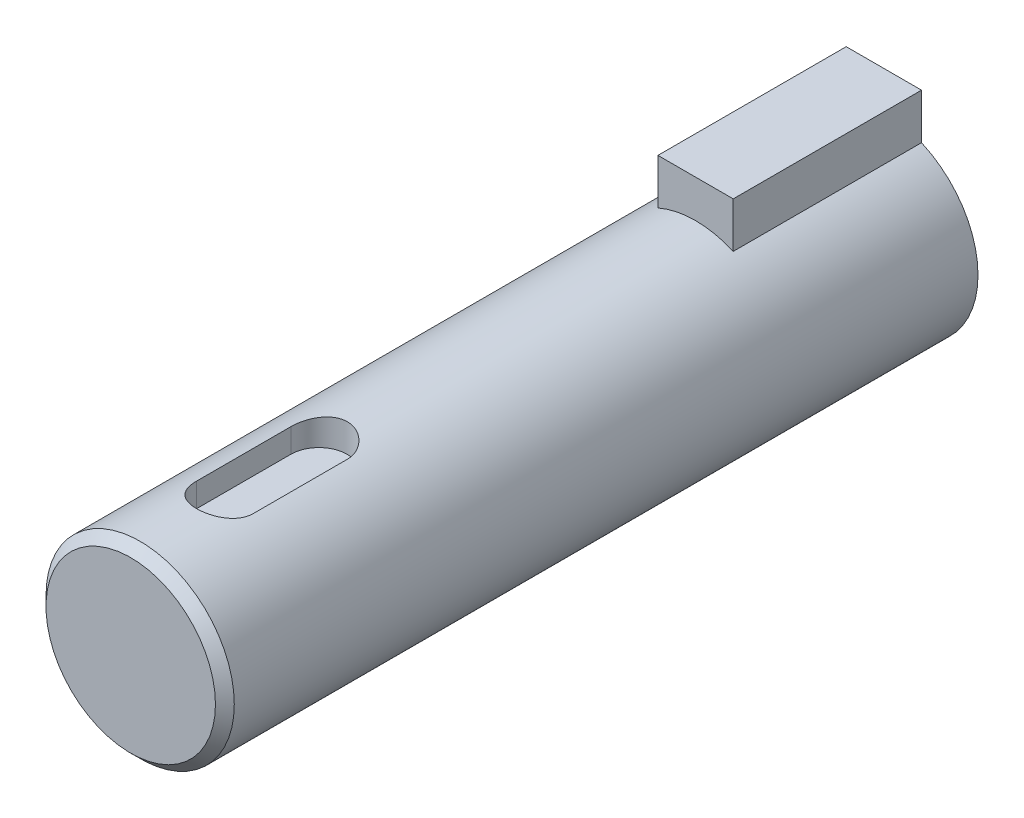
ISO-10303-21;
HEADER;
FILE_DESCRIPTION(('STEP AP214'),'2;1');
FILE_NAME('part.step','',(''),(''),'','','');
FILE_SCHEMA(('AUTOMOTIVE_DESIGN { 1 0 10303 214 1 1 1 1 }'));
ENDSEC;
DATA;
#1=APPLICATION_CONTEXT('core data for automotive mechanical design processes');
#2=APPLICATION_PROTOCOL_DEFINITION('international standard','automotive_design',2000,#1);
#3=PRODUCT_CONTEXT('',#1,'mechanical');
#4=PRODUCT('Part','Part','',(#3));
#5=PRODUCT_RELATED_PRODUCT_CATEGORY('part','',(#4));
#6=PRODUCT_DEFINITION_FORMATION('','',#4);
#7=PRODUCT_DEFINITION_CONTEXT('part definition',#1,'design');
#8=PRODUCT_DEFINITION('design','',#6,#7);
#9=PRODUCT_DEFINITION_SHAPE('','',#8);
#10=(LENGTH_UNIT() NAMED_UNIT(*) SI_UNIT(.MILLI.,.METRE.));
#11=(NAMED_UNIT(*) PLANE_ANGLE_UNIT() SI_UNIT($,.RADIAN.));
#12=(NAMED_UNIT(*) SI_UNIT($,.STERADIAN.) SOLID_ANGLE_UNIT());
#13=UNCERTAINTY_MEASURE_WITH_UNIT(LENGTH_MEASURE(1.E-05),#10,'distance_accuracy_value','');
#14=(GEOMETRIC_REPRESENTATION_CONTEXT(3) GLOBAL_UNCERTAINTY_ASSIGNED_CONTEXT((#13)) GLOBAL_UNIT_ASSIGNED_CONTEXT((#10,
#11,#12)) REPRESENTATION_CONTEXT('',''));
#15=CARTESIAN_POINT('',(0.,0.,0.));
#16=DIRECTION('',(0.,0.,1.));
#17=DIRECTION('',(1.,0.,0.));
#18=AXIS2_PLACEMENT_3D('',#15,#16,#17);
#19=CARTESIAN_POINT('',(0.,0.,10.));
#20=DIRECTION('',(0.,0.,-1.));
#21=DIRECTION('',(-1.,0.,0.));
#22=AXIS2_PLACEMENT_3D('',#19,#20,#21);
#23=CYLINDRICAL_SURFACE('',#22,5.);
#24=CARTESIAN_POINT('',(0.,0.,39.5));
#25=DIRECTION('',(0.,0.,1.));
#26=DIRECTION('',(1.,0.,0.));
#27=AXIS2_PLACEMENT_3D('',#24,#25,#26);
#28=CIRCLE('',#27,5.);
#29=CARTESIAN_POINT('',(5.,0.,39.5));
#30=VERTEX_POINT('',#29);
#31=EDGE_CURVE('E11',#30,#30,#28,.F.);
#32=ORIENTED_EDGE('',*,*,#31,.T.);
#33=EDGE_LOOP('',(#32));
#34=FACE_BOUND('',#33,.T.);
#35=CARTESIAN_POINT('',(0.,0.,0.));
#36=DIRECTION('',(0.,0.,1.));
#37=DIRECTION('',(1.,0.,0.));
#38=AXIS2_PLACEMENT_3D('',#35,#36,#37);
#39=CIRCLE('',#38,5.);
#40=CARTESIAN_POINT('',(-2.,4.58257569495585,0.));
#41=VERTEX_POINT('',#40);
#42=CARTESIAN_POINT('',(2.00000000000001,4.58257569495584,0.));
#43=VERTEX_POINT('',#42);
#44=EDGE_CURVE('E82',#41,#43,#39,.T.);
#45=ORIENTED_EDGE('',*,*,#44,.T.);
#46=DIRECTION('',(0.,0.,-1.));
#47=VECTOR('',#46,1.);
#48=CARTESIAN_POINT('',(2.,4.58257569495584,10.));
#49=LINE('',#48,#47);
#50=CARTESIAN_POINT('',(2.,4.58257569495584,10.));
#51=VERTEX_POINT('',#50);
#52=EDGE_CURVE('E154',#51,#43,#49,.T.);
#53=ORIENTED_EDGE('',*,*,#52,.F.);
#54=CARTESIAN_POINT('',(0.,0.,10.));
#55=DIRECTION('',(0.,0.,1.));
#56=DIRECTION('',(1.,0.,0.));
#57=AXIS2_PLACEMENT_3D('',#54,#55,#56);
#58=CIRCLE('',#57,5.);
#59=CARTESIAN_POINT('',(-2.,4.58257569495585,10.));
#60=VERTEX_POINT('',#59);
#61=EDGE_CURVE('E124',#51,#60,#58,.T.);
#62=ORIENTED_EDGE('',*,*,#61,.T.);
#63=DIRECTION('',(0.,0.,-1.));
#64=VECTOR('',#63,1.);
#65=CARTESIAN_POINT('',(-2.,4.58257569495585,10.));
#66=LINE('',#65,#64);
#67=EDGE_CURVE('E163',#60,#41,#66,.T.);
#68=ORIENTED_EDGE('',*,*,#67,.T.);
#69=EDGE_LOOP('',(#45,#53,#62,#68));
#70=FACE_BOUND('',#69,.T.);
#71=CARTESIAN_POINT('',(1.5,4.76969600708473,30.));
#72=CARTESIAN_POINT('',(1.5000008535707,4.76969249084934,29.958820607092));
#73=CARTESIAN_POINT('',(1.49830317083427,4.77022997000129,29.9176619568739));
#74=CARTESIAN_POINT('',(1.49153785660316,4.77235095109998,29.8356588379045));
#75=CARTESIAN_POINT('',(1.4864709827584,4.77393421787376,29.7948143006051));
#76=CARTESIAN_POINT('',(1.4663020368931,4.78018490618873,29.6734094590454));
#77=CARTESIAN_POINT('',(1.44623120413662,4.78635370384275,29.5936936095836));
#78=CARTESIAN_POINT('',(1.39353102315626,4.80195952113209,29.4389644216141));
#79=CARTESIAN_POINT('',(1.36090607068203,4.81139539670393,29.3639494478019));
#80=CARTESIAN_POINT('',(1.28407841117655,4.83246571212052,29.2204033184024));
#81=CARTESIAN_POINT('',(1.23987031651226,4.84410117434933,29.1518752002716));
#82=CARTESIAN_POINT('',(1.13964850658326,4.86866835244721,29.021133944003));
#83=CARTESIAN_POINT('',(1.08333433465208,4.88162755412974,28.9591563396566));
#84=CARTESIAN_POINT('',(0.96113891987335,4.9071481155905,28.8453644161001));
#85=CARTESIAN_POINT('',(0.895256063916347,4.91970940785251,28.793551813997));
#86=CARTESIAN_POINT('',(0.754109921315429,4.94333239727707,28.7005362296815));
#87=CARTESIAN_POINT('',(0.678680819336255,4.95435770971354,28.6595748197021));
#88=CARTESIAN_POINT('',(0.521621185505771,4.97334469846208,28.5910115883819));
#89=CARTESIAN_POINT('',(0.439992259012927,4.98130716463904,28.5634063222057));
#90=CARTESIAN_POINT('',(0.27532469787488,4.99307639935003,28.523120200898));
#91=CARTESIAN_POINT('',(0.192393125294255,4.99699549276993,28.5100351420303));
#92=CARTESIAN_POINT('',(0.0254235719980827,5.00063202022425,28.4978826586368));
#93=CARTESIAN_POINT('',(-0.0586141962423612,5.00035024971471,28.4988125802999));
#94=CARTESIAN_POINT('',(-0.222571599946015,4.99569602566267,28.514392908759));
#95=CARTESIAN_POINT('',(-0.30253714546464,4.99145415509187,28.5286053449787));
#96=CARTESIAN_POINT('',(-0.458890052102028,4.9795151369998,28.5696316352381));
#97=CARTESIAN_POINT('',(-0.535277225532003,4.9718178084603,28.596446149456));
#98=CARTESIAN_POINT('',(-0.683347815892222,4.95365214926146,28.6622122216465));
#99=CARTESIAN_POINT('',(-0.754966006044144,4.94315255692526,28.701301644357));
#100=CARTESIAN_POINT('',(-0.890765529574421,4.92049624651755,28.7903985900483));
#101=CARTESIAN_POINT('',(-0.954945191614599,4.90833915735885,28.8404085594788));
#102=CARTESIAN_POINT('',(-1.07665450541275,4.8831167357141,28.9521919880835));
#103=CARTESIAN_POINT('',(-1.13383351478034,4.87003445449554,29.0143438637608));
#104=CARTESIAN_POINT('',(-1.23706769492487,4.84484215114658,29.1474974234279));
#105=CARTESIAN_POINT('',(-1.28311962013077,4.83273241337566,29.2185016803655));
#106=CARTESIAN_POINT('',(-1.36316407240863,4.81077228795653,29.3682809284493));
#107=CARTESIAN_POINT('',(-1.39703006341135,4.80094596245948,29.4471271795934));
#108=CARTESIAN_POINT('',(-1.45085886004699,4.78495663653201,29.6097245039818));
#109=CARTESIAN_POINT('',(-1.47084293218035,4.77878803475877,29.6934678607144));
#110=CARTESIAN_POINT('',(-1.48901203590079,4.77314032325007,29.8149948890702));
#111=CARTESIAN_POINT('',(-1.49313202989009,4.77185156275267,29.8518907341796));
#112=CARTESIAN_POINT('',(-1.49862355614855,4.77012928611782,29.9258514790995));
#113=CARTESIAN_POINT('',(-1.49999912968269,4.76969451246643,29.9629160496639));
#114=CARTESIAN_POINT('',(-1.5,4.76969600708473,30.));
#115=B_SPLINE_CURVE_WITH_KNOTS('',3,(#71,#72,#73,#74,#75,#76,#77,#78,#79,#80,#81,#82,#83,#84,
#85,#86,#87,#88,#89,#90,#91,#92,#93,#94,#95,#96,#97,#98,#99,#100,#101,#102,#103,#104,#105,#106,
#107,#108,#109,#110,#111,#112,#113,#114),.UNSPECIFIED.,.F.,.F.,(4,2,2,2,2,2,2,2,2,2,2,2,2,2,2,2,
2,2,2,2,2,4),(0.,0.123459071219734,0.246890388853044,0.492911349615218,0.738846245884327,
0.984895736828089,1.23795510798803,1.49105719006936,1.74939356197455,2.00766326783256,
2.25854751319801,2.5093842528947,2.75223130012966,2.99509107067835,3.2407824256273,
3.48652887757004,3.74172568310981,3.99699683536778,4.25484698071527,4.51230123440206,
4.62365084745809,4.73483637253615),.UNSPECIFIED.);
#116=CARTESIAN_POINT('',(1.5,4.76969600708473,30.));
#117=VERTEX_POINT('',#116);
#118=CARTESIAN_POINT('',(-1.5,4.76969600708473,30.));
#119=VERTEX_POINT('',#118);
#120=EDGE_CURVE('E121',#117,#119,#115,.T.);
#121=ORIENTED_EDGE('',*,*,#120,.F.);
#122=DIRECTION('',(0.,0.,-1.));
#123=VECTOR('',#122,1.);
#124=CARTESIAN_POINT('',(1.49999999999999,4.76969600708474,10.));
#125=LINE('',#124,#123);
#126=CARTESIAN_POINT('',(1.49999999999999,4.76969600708474,35.));
#127=VERTEX_POINT('',#126);
#128=EDGE_CURVE('E170',#127,#117,#125,.T.);
#129=ORIENTED_EDGE('',*,*,#128,.F.);
#130=CARTESIAN_POINT('',(-1.5,4.76969600708473,35.));
#131=CARTESIAN_POINT('',(-1.5000008535707,4.76969249084934,35.041179392908));
#132=CARTESIAN_POINT('',(-1.49830317083427,4.77022997000129,35.0823380431262));
#133=CARTESIAN_POINT('',(-1.49153785660316,4.77235095109999,35.1643411620956));
#134=CARTESIAN_POINT('',(-1.48647098275841,4.77393421787376,35.2051856993949));
#135=CARTESIAN_POINT('',(-1.46630203689311,4.78018490618874,35.3265905409547));
#136=CARTESIAN_POINT('',(-1.44623120413662,4.78635370384276,35.4063063904164));
#137=CARTESIAN_POINT('',(-1.39353102315626,4.8019595211321,35.5610355783859));
#138=CARTESIAN_POINT('',(-1.36090607068203,4.81139539670393,35.6360505521981));
#139=CARTESIAN_POINT('',(-1.28407841117656,4.83246571212052,35.7795966815976));
#140=CARTESIAN_POINT('',(-1.23987031651226,4.84410117434935,35.8481247997285));
#141=CARTESIAN_POINT('',(-1.13964850658326,4.86866835244722,35.9788660559971));
#142=CARTESIAN_POINT('',(-1.08333433465208,4.88162755412974,36.0408436603434));
#143=CARTESIAN_POINT('',(-0.961138919873351,4.9071481155905,36.1546355839));
#144=CARTESIAN_POINT('',(-0.895256063916347,4.91970940785251,36.2064481860031));
#145=CARTESIAN_POINT('',(-0.754109921315428,4.94333239727707,36.2994637703185));
#146=CARTESIAN_POINT('',(-0.678680819336255,4.95435770971354,36.340425180298));
#147=CARTESIAN_POINT('',(-0.521621185505768,4.97334469846208,36.4089884116182));
#148=CARTESIAN_POINT('',(-0.439992259012922,4.98130716463904,36.4365936777943));
#149=CARTESIAN_POINT('',(-0.275324697874874,4.99307639935003,36.4768797991021));
#150=CARTESIAN_POINT('',(-0.19239312529425,4.99699549276993,36.4899648579698));
#151=CARTESIAN_POINT('',(-0.0254235719980796,5.00063202022426,36.5021173413633));
#152=CARTESIAN_POINT('',(0.0586141962423633,5.00035024971471,36.5011874197002));
#153=CARTESIAN_POINT('',(0.222571599946017,4.99569602566267,36.485607091241));
#154=CARTESIAN_POINT('',(0.302537145464641,4.99145415509187,36.4713946550213));
#155=CARTESIAN_POINT('',(0.458890052102024,4.9795151369998,36.4303683647619));
#156=CARTESIAN_POINT('',(0.535277225531996,4.9718178084603,36.4035538505441));
#157=CARTESIAN_POINT('',(0.683347815892215,4.95365214926146,36.3377877783536));
#158=CARTESIAN_POINT('',(0.754966006044142,4.94315255692525,36.2986983556431));
#159=CARTESIAN_POINT('',(0.890765529574421,4.92049624651755,36.2096014099517));
#160=CARTESIAN_POINT('',(0.954945191614594,4.90833915735885,36.1595914405212));
#161=CARTESIAN_POINT('',(1.07665450541275,4.8831167357141,36.0478080119165));
#162=CARTESIAN_POINT('',(1.13383351478034,4.87003445449554,35.9856561362393));
#163=CARTESIAN_POINT('',(1.23706769492488,4.84484215114658,35.8525025765721));
#164=CARTESIAN_POINT('',(1.28311962013078,4.83273241337566,35.7814983196345));
#165=CARTESIAN_POINT('',(1.36316407240863,4.81077228795653,35.6317190715507));
#166=CARTESIAN_POINT('',(1.39703006341135,4.80094596245948,35.5528728204066));
#167=CARTESIAN_POINT('',(1.450858860047,4.784956636532,35.3902754960183));
#168=CARTESIAN_POINT('',(1.47084293218036,4.77878803475875,35.3065321392857));
#169=CARTESIAN_POINT('',(1.4890120359008,4.77314032325006,35.1850051109298));
#170=CARTESIAN_POINT('',(1.49313202989009,4.77185156275266,35.1481092658204));
#171=CARTESIAN_POINT('',(1.49862355614854,4.77012928611782,35.0741485209005));
#172=CARTESIAN_POINT('',(1.49999912968269,4.76969451246644,35.0370839503362));
#173=CARTESIAN_POINT('',(1.5,4.76969600708474,35.));
#174=B_SPLINE_CURVE_WITH_KNOTS('',3,(#130,#131,#132,#133,#134,#135,#136,#137,#138,#139,#140,
#141,#142,#143,#144,#145,#146,#147,#148,#149,#150,#151,#152,#153,#154,#155,#156,#157,#158,#159,
#160,#161,#162,#163,#164,#165,#166,#167,#168,#169,#170,#171,#172,#173),.UNSPECIFIED.,.F.,.F.,(4,
2,2,2,2,2,2,2,2,2,2,2,2,2,2,2,2,2,2,2,2,4),(0.,0.123459071219744,0.246890388853047,
0.492911349615206,0.738846245884321,0.984895736828089,1.23795510798803,1.49105719006936,
1.74939356197456,2.00766326783256,2.25854751319802,2.5093842528947,2.75223130012966,
2.99509107067835,3.2407824256273,3.48652887757005,3.74172568310982,3.99699683536778,
4.25484698071527,4.51230123440207,4.62365084745808,4.73483637253615),.UNSPECIFIED.);
#175=CARTESIAN_POINT('',(-1.5,4.76969600708473,35.));
#176=VERTEX_POINT('',#175);
#177=EDGE_CURVE('E172',#176,#127,#174,.T.);
#178=ORIENTED_EDGE('',*,*,#177,.F.);
#179=DIRECTION('',(0.,0.,-1.));
#180=VECTOR('',#179,1.);
#181=CARTESIAN_POINT('',(-1.50000000000001,4.76969600708474,10.));
#182=LINE('',#181,#180);
#183=EDGE_CURVE('E180',#119,#176,#182,.F.);
#184=ORIENTED_EDGE('',*,*,#183,.F.);
#185=EDGE_LOOP('',(#121,#129,#178,#184));
#186=FACE_BOUND('',#185,.T.);
#187=ADVANCED_FACE('F36',(#34,#70,#186),#23,.T.);
#188=CARTESIAN_POINT('',(2.,7.00000000000001,10.));
#189=DIRECTION('',(-1.,0.,0.));
#190=DIRECTION('',(0.,0.,1.));
#191=AXIS2_PLACEMENT_3D('',#188,#189,#190);
#192=PLANE('',#191);
#193=DIRECTION('',(0.,1.,0.));
#194=VECTOR('',#193,1.);
#195=CARTESIAN_POINT('',(2.,7.00000000000001,0.));
#196=LINE('',#195,#194);
#197=CARTESIAN_POINT('',(2.,7.00000000000001,0.));
#198=VERTEX_POINT('',#197);
#199=EDGE_CURVE('E149',#43,#198,#196,.T.);
#200=ORIENTED_EDGE('',*,*,#199,.T.);
#201=DIRECTION('',(0.,0.,-1.));
#202=VECTOR('',#201,1.);
#203=CARTESIAN_POINT('',(2.,7.00000000000001,10.));
#204=LINE('',#203,#202);
#205=CARTESIAN_POINT('',(2.,7.00000000000001,10.));
#206=VERTEX_POINT('',#205);
#207=EDGE_CURVE('E168',#206,#198,#204,.T.);
#208=ORIENTED_EDGE('',*,*,#207,.F.);
#209=DIRECTION('',(0.,1.,0.));
#210=VECTOR('',#209,1.);
#211=CARTESIAN_POINT('',(2.,7.00000000000001,10.));
#212=LINE('',#211,#210);
#213=EDGE_CURVE('E150',#51,#206,#212,.T.);
#214=ORIENTED_EDGE('',*,*,#213,.F.);
#215=ORIENTED_EDGE('',*,*,#52,.T.);
#216=EDGE_LOOP('',(#200,#208,#214,#215));
#217=FACE_BOUND('',#216,.T.);
#218=ADVANCED_FACE('F215',(#217),#192,.F.);
#219=CARTESIAN_POINT('',(2.,7.00000000000001,10.));
#220=DIRECTION('',(0.,-1.,0.));
#221=DIRECTION('',(0.,0.,-1.));
#222=AXIS2_PLACEMENT_3D('',#219,#220,#221);
#223=PLANE('',#222);
#224=DIRECTION('',(-1.,0.,0.));
#225=VECTOR('',#224,1.);
#226=CARTESIAN_POINT('',(2.,7.00000000000001,0.));
#227=LINE('',#226,#225);
#228=CARTESIAN_POINT('',(-2.,7.00000000000001,0.));
#229=VERTEX_POINT('',#228);
#230=EDGE_CURVE('E157',#198,#229,#227,.T.);
#231=ORIENTED_EDGE('',*,*,#230,.T.);
#232=DIRECTION('',(0.,0.,-1.));
#233=VECTOR('',#232,1.);
#234=CARTESIAN_POINT('',(-2.00000000000001,7.00000000000001,10.));
#235=LINE('',#234,#233);
#236=CARTESIAN_POINT('',(-2.00000000000001,7.00000000000001,10.));
#237=VERTEX_POINT('',#236);
#238=EDGE_CURVE('E165',#237,#229,#235,.T.);
#239=ORIENTED_EDGE('',*,*,#238,.F.);
#240=DIRECTION('',(-1.,0.,0.));
#241=VECTOR('',#240,1.);
#242=CARTESIAN_POINT('',(2.,7.00000000000001,10.));
#243=LINE('',#242,#241);
#244=EDGE_CURVE('E88',#206,#237,#243,.T.);
#245=ORIENTED_EDGE('',*,*,#244,.F.);
#246=ORIENTED_EDGE('',*,*,#207,.T.);
#247=EDGE_LOOP('',(#231,#239,#245,#246));
#248=FACE_BOUND('',#247,.T.);
#249=ADVANCED_FACE('F220',(#248),#223,.F.);
#250=CARTESIAN_POINT('',(-2.00000000000001,7.00000000000001,10.));
#251=DIRECTION('',(1.,0.,0.));
#252=DIRECTION('',(0.,0.,-1.));
#253=AXIS2_PLACEMENT_3D('',#250,#251,#252);
#254=PLANE('',#253);
#255=DIRECTION('',(0.,-1.,0.));
#256=VECTOR('',#255,1.);
#257=CARTESIAN_POINT('',(-2.,7.00000000000001,0.));
#258=LINE('',#257,#256);
#259=EDGE_CURVE('E159',#229,#41,#258,.T.);
#260=ORIENTED_EDGE('',*,*,#259,.T.);
#261=ORIENTED_EDGE('',*,*,#67,.F.);
#262=DIRECTION('',(0.,-1.,0.));
#263=VECTOR('',#262,1.);
#264=CARTESIAN_POINT('',(-2.00000000000001,7.00000000000001,10.));
#265=LINE('',#264,#263);
#266=EDGE_CURVE('E61',#237,#60,#265,.T.);
#267=ORIENTED_EDGE('',*,*,#266,.F.);
#268=ORIENTED_EDGE('',*,*,#238,.T.);
#269=EDGE_LOOP('',(#260,#261,#267,#268));
#270=FACE_BOUND('',#269,.T.);
#271=ADVANCED_FACE('F266',(#270),#254,.F.);
#272=CARTESIAN_POINT('',(0.,0.,10.));
#273=DIRECTION('',(0.,0.,1.));
#274=DIRECTION('',(1.,0.,0.));
#275=AXIS2_PLACEMENT_3D('',#272,#273,#274);
#276=PLANE('',#275);
#277=ORIENTED_EDGE('',*,*,#61,.F.);
#278=ORIENTED_EDGE('',*,*,#213,.T.);
#279=ORIENTED_EDGE('',*,*,#244,.T.);
#280=ORIENTED_EDGE('',*,*,#266,.T.);
#281=EDGE_LOOP('',(#277,#278,#279,#280));
#282=FACE_BOUND('',#281,.T.);
#283=ADVANCED_FACE('F259',(#282),#276,.T.);
#284=CARTESIAN_POINT('',(0.,0.,0.));
#285=DIRECTION('',(0.,0.,1.));
#286=DIRECTION('',(1.,0.,0.));
#287=AXIS2_PLACEMENT_3D('',#284,#285,#286);
#288=PLANE('',#287);
#289=ORIENTED_EDGE('',*,*,#199,.F.);
#290=ORIENTED_EDGE('',*,*,#44,.F.);
#291=ORIENTED_EDGE('',*,*,#259,.F.);
#292=ORIENTED_EDGE('',*,*,#230,.F.);
#293=EDGE_LOOP('',(#289,#290,#291,#292));
#294=FACE_BOUND('',#293,.T.);
#295=ADVANCED_FACE('F252',(#294),#288,.F.);
#296=CARTESIAN_POINT('',(0.,0.,40.));
#297=DIRECTION('',(0.,0.,1.));
#298=DIRECTION('',(1.,0.,0.));
#299=AXIS2_PLACEMENT_3D('',#296,#297,#298);
#300=PLANE('',#299);
#301=CARTESIAN_POINT('',(0.,0.,40.));
#302=DIRECTION('',(0.,0.,1.));
#303=DIRECTION('',(1.,0.,0.));
#304=AXIS2_PLACEMENT_3D('',#301,#302,#303);
#305=CIRCLE('',#304,4.5);
#306=CARTESIAN_POINT('',(4.50000000000001,0.,40.));
#307=VERTEX_POINT('',#306);
#308=EDGE_CURVE('E45',#307,#307,#305,.T.);
#309=ORIENTED_EDGE('',*,*,#308,.T.);
#310=EDGE_LOOP('',(#309));
#311=FACE_BOUND('',#310,.T.);
#312=ADVANCED_FACE('F198',(#311),#300,.T.);
#313=CARTESIAN_POINT('',(0.,7.00000000000001,30.));
#314=DIRECTION('',(0.,-1.,0.));
#315=DIRECTION('',(0.,0.,-1.));
#316=AXIS2_PLACEMENT_3D('',#313,#314,#315);
#317=CYLINDRICAL_SURFACE('',#316,1.5);
#318=ORIENTED_EDGE('',*,*,#120,.T.);
#319=DIRECTION('',(0.,-1.,0.));
#320=VECTOR('',#319,1.);
#321=CARTESIAN_POINT('',(-1.5,7.00000000000001,30.));
#322=LINE('',#321,#320);
#323=CARTESIAN_POINT('',(-1.5,3.50000000000001,30.));
#324=VERTEX_POINT('',#323);
#325=EDGE_CURVE('E114',#119,#324,#322,.T.);
#326=ORIENTED_EDGE('',*,*,#325,.T.);
#327=CARTESIAN_POINT('',(0.,3.5,30.));
#328=DIRECTION('',(0.,1.,0.));
#329=DIRECTION('',(0.,0.,1.));
#330=AXIS2_PLACEMENT_3D('',#327,#328,#329);
#331=CIRCLE('',#330,1.5);
#332=CARTESIAN_POINT('',(1.5,3.50000000000002,30.));
#333=VERTEX_POINT('',#332);
#334=EDGE_CURVE('E119',#333,#324,#331,.T.);
#335=ORIENTED_EDGE('',*,*,#334,.F.);
#336=DIRECTION('',(0.,-1.,0.));
#337=VECTOR('',#336,1.);
#338=CARTESIAN_POINT('',(1.5,7.00000000000003,30.));
#339=LINE('',#338,#337);
#340=EDGE_CURVE('E143',#117,#333,#339,.T.);
#341=ORIENTED_EDGE('',*,*,#340,.F.);
#342=EDGE_LOOP('',(#318,#326,#335,#341));
#343=FACE_BOUND('',#342,.T.);
#344=ADVANCED_FACE('F116',(#343),#317,.F.);
#345=CARTESIAN_POINT('',(-1.5,7.00000000000001,30.));
#346=DIRECTION('',(1.,0.,0.));
#347=DIRECTION('',(0.,0.,-1.));
#348=AXIS2_PLACEMENT_3D('',#345,#346,#347);
#349=PLANE('',#348);
#350=ORIENTED_EDGE('',*,*,#183,.T.);
#351=DIRECTION('',(0.,-1.,0.));
#352=VECTOR('',#351,1.);
#353=CARTESIAN_POINT('',(-1.5,7.00000000000001,35.));
#354=LINE('',#353,#352);
#355=CARTESIAN_POINT('',(-1.5,3.50000000000001,35.));
#356=VERTEX_POINT('',#355);
#357=EDGE_CURVE('E125',#176,#356,#354,.T.);
#358=ORIENTED_EDGE('',*,*,#357,.T.);
#359=DIRECTION('',(0.,0.,1.));
#360=VECTOR('',#359,1.);
#361=CARTESIAN_POINT('',(-1.5,3.50000000000001,30.));
#362=LINE('',#361,#360);
#363=EDGE_CURVE('E128',#324,#356,#362,.T.);
#364=ORIENTED_EDGE('',*,*,#363,.F.);
#365=ORIENTED_EDGE('',*,*,#325,.F.);
#366=EDGE_LOOP('',(#350,#358,#364,#365));
#367=FACE_BOUND('',#366,.T.);
#368=ADVANCED_FACE('F129',(#367),#349,.T.);
#369=CARTESIAN_POINT('',(0.,7.00000000000001,35.));
#370=DIRECTION('',(0.,-1.,0.));
#371=DIRECTION('',(0.,0.,-1.));
#372=AXIS2_PLACEMENT_3D('',#369,#370,#371);
#373=CYLINDRICAL_SURFACE('',#372,1.5);
#374=ORIENTED_EDGE('',*,*,#177,.T.);
#375=DIRECTION('',(0.,-1.,0.));
#376=VECTOR('',#375,1.);
#377=CARTESIAN_POINT('',(1.5,7.00000000000003,35.));
#378=LINE('',#377,#376);
#379=CARTESIAN_POINT('',(1.5,3.50000000000002,35.));
#380=VERTEX_POINT('',#379);
#381=EDGE_CURVE('E52',#127,#380,#378,.T.);
#382=ORIENTED_EDGE('',*,*,#381,.T.);
#383=CARTESIAN_POINT('',(0.,3.5,35.));
#384=DIRECTION('',(0.,1.,0.));
#385=DIRECTION('',(0.,0.,1.));
#386=AXIS2_PLACEMENT_3D('',#383,#384,#385);
#387=CIRCLE('',#386,1.5);
#388=EDGE_CURVE('E134',#356,#380,#387,.T.);
#389=ORIENTED_EDGE('',*,*,#388,.F.);
#390=ORIENTED_EDGE('',*,*,#357,.F.);
#391=EDGE_LOOP('',(#374,#382,#389,#390));
#392=FACE_BOUND('',#391,.T.);
#393=ADVANCED_FACE('F185',(#392),#373,.F.);
#394=CARTESIAN_POINT('',(1.5,7.00000000000003,30.));
#395=DIRECTION('',(-1.,0.,0.));
#396=DIRECTION('',(0.,0.,1.));
#397=AXIS2_PLACEMENT_3D('',#394,#395,#396);
#398=PLANE('',#397);
#399=ORIENTED_EDGE('',*,*,#128,.T.);
#400=ORIENTED_EDGE('',*,*,#340,.T.);
#401=DIRECTION('',(0.,0.,-1.));
#402=VECTOR('',#401,1.);
#403=CARTESIAN_POINT('',(1.5,3.50000000000002,30.));
#404=LINE('',#403,#402);
#405=EDGE_CURVE('E138',#380,#333,#404,.T.);
#406=ORIENTED_EDGE('',*,*,#405,.F.);
#407=ORIENTED_EDGE('',*,*,#381,.F.);
#408=EDGE_LOOP('',(#399,#400,#406,#407));
#409=FACE_BOUND('',#408,.T.);
#410=ADVANCED_FACE('F190',(#409),#398,.T.);
#411=CARTESIAN_POINT('',(0.,3.5,30.));
#412=DIRECTION('',(0.,1.,0.));
#413=DIRECTION('',(0.,0.,1.));
#414=AXIS2_PLACEMENT_3D('',#411,#412,#413);
#415=PLANE('',#414);
#416=ORIENTED_EDGE('',*,*,#334,.T.);
#417=ORIENTED_EDGE('',*,*,#363,.T.);
#418=ORIENTED_EDGE('',*,*,#388,.T.);
#419=ORIENTED_EDGE('',*,*,#405,.T.);
#420=EDGE_LOOP('',(#416,#417,#418,#419));
#421=FACE_BOUND('',#420,.T.);
#422=ADVANCED_FACE('F137',(#421),#415,.T.);
#423=CARTESIAN_POINT('',(0.,0.,40.));
#424=DIRECTION('',(0.,0.,-1.));
#425=DIRECTION('',(-1.,0.,0.));
#426=AXIS2_PLACEMENT_3D('',#423,#424,#425);
#427=CONICAL_SURFACE('',#426,4.5,0.785398163397458);
#428=ORIENTED_EDGE('',*,*,#31,.F.);
#429=EDGE_LOOP('',(#428));
#430=FACE_BOUND('',#429,.T.);
#431=ORIENTED_EDGE('',*,*,#308,.F.);
#432=EDGE_LOOP('',(#431));
#433=FACE_BOUND('',#432,.T.);
#434=ADVANCED_FACE('F39',(#430,#433),#427,.T.);
#435=CLOSED_SHELL('',(#187,#218,#249,#271,#283,#295,#312,#344,#368,#393,#410,#422,#434));
#436=MANIFOLD_SOLID_BREP('B2',#435);
#437=ADVANCED_BREP_SHAPE_REPRESENTATION('',(#18,#436),#14);
#438=SHAPE_DEFINITION_REPRESENTATION(#9,#437);
ENDSEC;
END-ISO-10303-21;
